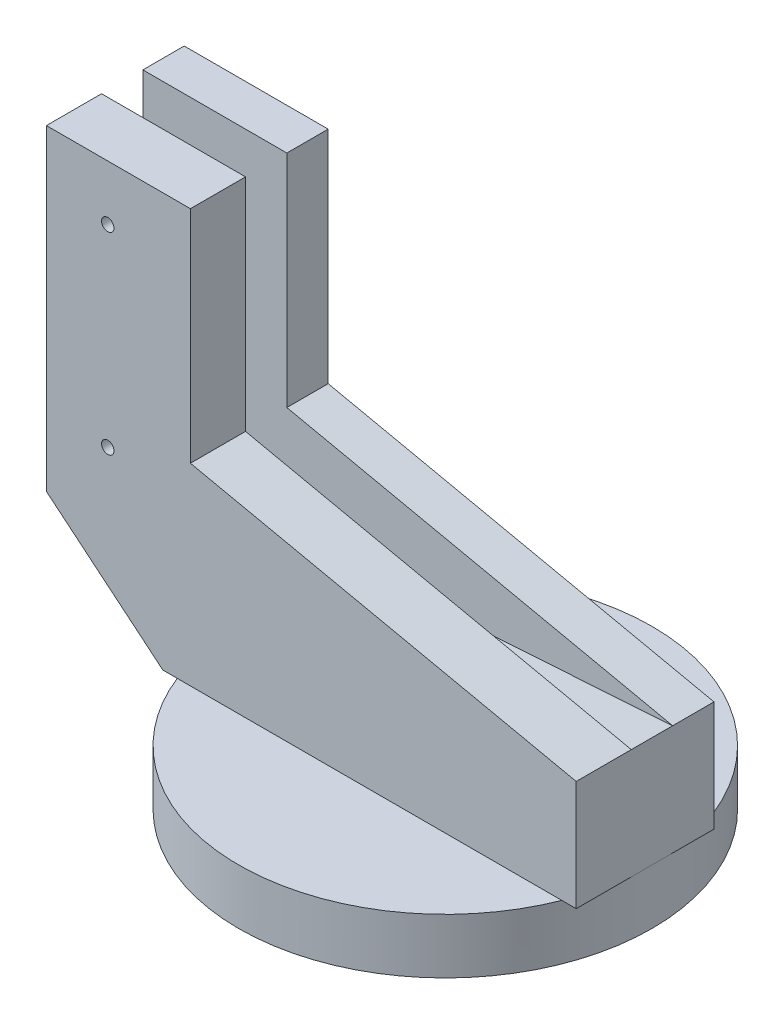
ISO-10303-21;
HEADER;
FILE_DESCRIPTION(('STEP AP214'),'2;1');
FILE_NAME('part.step','',(''),(''),'','','');
FILE_SCHEMA(('AUTOMOTIVE_DESIGN { 1 0 10303 214 1 1 1 1 }'));
ENDSEC;
DATA;
#1=APPLICATION_CONTEXT('core data for automotive mechanical design processes');
#2=APPLICATION_PROTOCOL_DEFINITION('international standard','automotive_design',2000,#1);
#3=PRODUCT_CONTEXT('',#1,'mechanical');
#4=PRODUCT('Part','Part','',(#3));
#5=PRODUCT_RELATED_PRODUCT_CATEGORY('part','',(#4));
#6=PRODUCT_DEFINITION_FORMATION('','',#4);
#7=PRODUCT_DEFINITION_CONTEXT('part definition',#1,'design');
#8=PRODUCT_DEFINITION('design','',#6,#7);
#9=PRODUCT_DEFINITION_SHAPE('','',#8);
#10=(LENGTH_UNIT() NAMED_UNIT(*) SI_UNIT(.MILLI.,.METRE.));
#11=(NAMED_UNIT(*) PLANE_ANGLE_UNIT() SI_UNIT($,.RADIAN.));
#12=(NAMED_UNIT(*) SI_UNIT($,.STERADIAN.) SOLID_ANGLE_UNIT());
#13=UNCERTAINTY_MEASURE_WITH_UNIT(LENGTH_MEASURE(1.E-05),#10,'distance_accuracy_value','');
#14=(GEOMETRIC_REPRESENTATION_CONTEXT(3) GLOBAL_UNCERTAINTY_ASSIGNED_CONTEXT((#13)) GLOBAL_UNIT_ASSIGNED_CONTEXT((#10,
#11,#12)) REPRESENTATION_CONTEXT('',''));
#15=CARTESIAN_POINT('',(0.,0.,0.));
#16=DIRECTION('',(0.,0.,1.));
#17=DIRECTION('',(1.,0.,0.));
#18=AXIS2_PLACEMENT_3D('',#15,#16,#17);
#19=CARTESIAN_POINT('',(0.,20.,0.));
#20=DIRECTION('',(0.,1.,0.));
#21=DIRECTION('',(0.,0.,1.));
#22=AXIS2_PLACEMENT_3D('',#19,#20,#21);
#23=PLANE('',#22);
#24=CARTESIAN_POINT('',(0.,20.,0.));
#25=DIRECTION('',(0.,1.,0.));
#26=DIRECTION('',(0.,0.,1.));
#27=AXIS2_PLACEMENT_3D('',#24,#25,#26);
#28=CIRCLE('',#27,75.);
#29=CARTESIAN_POINT('',(-69.7764286847643,20.,27.5));
#30=VERTEX_POINT('',#29);
#31=CARTESIAN_POINT('',(69.7764286847643,20.,27.5));
#32=VERTEX_POINT('',#31);
#33=EDGE_CURVE('E417',#30,#32,#28,.T.);
#34=ORIENTED_EDGE('',*,*,#33,.T.);
#35=DIRECTION('',(1.,0.,0.));
#36=VECTOR('',#35,1.);
#37=CARTESIAN_POINT('',(0.,20.,27.5));
#38=LINE('',#37,#36);
#39=EDGE_CURVE('E344',#30,#32,#38,.T.);
#40=ORIENTED_EDGE('',*,*,#39,.F.);
#41=EDGE_LOOP('',(#34,#40));
#42=FACE_BOUND('',#41,.T.);
#43=ADVANCED_FACE('F137',(#42),#23,.T.);
#44=CARTESIAN_POINT('',(0.,20.,0.));
#45=DIRECTION('',(0.,-1.,0.));
#46=DIRECTION('',(0.,0.,-1.));
#47=AXIS2_PLACEMENT_3D('',#44,#45,#46);
#48=CYLINDRICAL_SURFACE('',#47,75.);
#49=CARTESIAN_POINT('',(75.,20.,0.));
#50=VERTEX_POINT('',#49);
#51=EDGE_CURVE('E12',#32,#50,#28,.T.);
#52=ORIENTED_EDGE('',*,*,#51,.F.);
#53=ORIENTED_EDGE('',*,*,#33,.F.);
#54=CARTESIAN_POINT('',(-75.,20.,0.));
#55=VERTEX_POINT('',#54);
#56=EDGE_CURVE('E415',#55,#30,#28,.T.);
#57=ORIENTED_EDGE('',*,*,#56,.F.);
#58=CARTESIAN_POINT('',(-71.5454401062709,20.,-22.5));
#59=VERTEX_POINT('',#58);
#60=EDGE_CURVE('E154',#59,#55,#28,.T.);
#61=ORIENTED_EDGE('',*,*,#60,.F.);
#62=CARTESIAN_POINT('',(71.5454401062709,20.,-22.5));
#63=VERTEX_POINT('',#62);
#64=EDGE_CURVE('E147',#63,#59,#28,.T.);
#65=ORIENTED_EDGE('',*,*,#64,.F.);
#66=EDGE_CURVE('E146',#50,#63,#28,.T.);
#67=ORIENTED_EDGE('',*,*,#66,.F.);
#68=EDGE_LOOP('',(#52,#53,#57,#61,#65,#67));
#69=FACE_BOUND('',#68,.T.);
#70=CARTESIAN_POINT('',(0.,0.,0.));
#71=DIRECTION('',(0.,1.,0.));
#72=DIRECTION('',(0.,0.,1.));
#73=AXIS2_PLACEMENT_3D('',#70,#71,#72);
#74=CIRCLE('',#73,75.);
#75=CARTESIAN_POINT('',(0.,0.,75.));
#76=VERTEX_POINT('',#75);
#77=EDGE_CURVE('E141',#76,#76,#74,.T.);
#78=ORIENTED_EDGE('',*,*,#77,.T.);
#79=EDGE_LOOP('',(#78));
#80=FACE_BOUND('',#79,.T.);
#81=ADVANCED_FACE('F139',(#69,#80),#48,.T.);
#82=DIRECTION('',(-1.,0.,0.));
#83=VECTOR('',#82,1.);
#84=CARTESIAN_POINT('',(0.,20.,-22.5));
#85=LINE('',#84,#83);
#86=EDGE_CURVE('E269',#63,#59,#85,.T.);
#87=ORIENTED_EDGE('',*,*,#86,.F.);
#88=ORIENTED_EDGE('',*,*,#64,.T.);
#89=EDGE_LOOP('',(#87,#88));
#90=FACE_BOUND('',#89,.T.);
#91=ADVANCED_FACE('F422',(#90),#23,.T.);
#92=CARTESIAN_POINT('',(0.,0.,0.));
#93=DIRECTION('',(0.,1.,0.));
#94=DIRECTION('',(0.,0.,1.));
#95=AXIS2_PLACEMENT_3D('',#92,#93,#94);
#96=PLANE('',#95);
#97=ORIENTED_EDGE('',*,*,#77,.F.);
#98=EDGE_LOOP('',(#97));
#99=FACE_BOUND('',#98,.T.);
#100=ADVANCED_FACE('F442',(#99),#96,.F.);
#101=CARTESIAN_POINT('',(0.,20.,-7.5));
#102=DIRECTION('',(0.,1.,0.));
#103=DIRECTION('',(0.,0.,1.));
#104=AXIS2_PLACEMENT_3D('',#101,#102,#103);
#105=PLANE('',#104);
#106=DIRECTION('',(0.,0.,1.));
#107=VECTOR('',#106,1.);
#108=CARTESIAN_POINT('',(75.,20.,-7.5));
#109=LINE('',#108,#107);
#110=CARTESIAN_POINT('',(75.,20.,27.5));
#111=VERTEX_POINT('',#110);
#112=EDGE_CURVE('E261',#50,#111,#109,.T.);
#113=ORIENTED_EDGE('',*,*,#112,.T.);
#114=EDGE_CURVE('E339',#32,#111,#38,.T.);
#115=ORIENTED_EDGE('',*,*,#114,.F.);
#116=ORIENTED_EDGE('',*,*,#51,.T.);
#117=EDGE_LOOP('',(#113,#115,#116));
#118=FACE_BOUND('',#117,.T.);
#119=ADVANCED_FACE('F434',(#118),#105,.F.);
#120=CARTESIAN_POINT('',(75.,20.,-22.5));
#121=VERTEX_POINT('',#120);
#122=EDGE_CURVE('E384',#121,#50,#109,.T.);
#123=ORIENTED_EDGE('',*,*,#122,.T.);
#124=ORIENTED_EDGE('',*,*,#66,.T.);
#125=EDGE_CURVE('E272',#121,#63,#85,.T.);
#126=ORIENTED_EDGE('',*,*,#125,.F.);
#127=EDGE_LOOP('',(#123,#124,#126));
#128=FACE_BOUND('',#127,.T.);
#129=ADVANCED_FACE('F425',(#128),#105,.F.);
#130=DIRECTION('',(0.,0.,1.));
#131=VECTOR('',#130,1.);
#132=CARTESIAN_POINT('',(-75.,20.,-7.5));
#133=LINE('',#132,#131);
#134=CARTESIAN_POINT('',(-75.,20.,-22.5));
#135=VERTEX_POINT('',#134);
#136=EDGE_CURVE('E253',#135,#55,#133,.T.);
#137=ORIENTED_EDGE('',*,*,#136,.F.);
#138=EDGE_CURVE('E256',#59,#135,#85,.T.);
#139=ORIENTED_EDGE('',*,*,#138,.F.);
#140=ORIENTED_EDGE('',*,*,#60,.T.);
#141=EDGE_LOOP('',(#137,#139,#140));
#142=FACE_BOUND('',#141,.T.);
#143=ADVANCED_FACE('F255',(#142),#105,.F.);
#144=CARTESIAN_POINT('',(-75.,20.,27.5));
#145=VERTEX_POINT('',#144);
#146=EDGE_CURVE('E262',#55,#145,#133,.T.);
#147=ORIENTED_EDGE('',*,*,#146,.F.);
#148=ORIENTED_EDGE('',*,*,#56,.T.);
#149=EDGE_CURVE('E340',#145,#30,#38,.T.);
#150=ORIENTED_EDGE('',*,*,#149,.F.);
#151=EDGE_LOOP('',(#147,#148,#150));
#152=FACE_BOUND('',#151,.T.);
#153=ADVANCED_FACE('F414',(#152),#105,.F.);
#154=CARTESIAN_POINT('',(-3.65044247787614,54.7566371681415,-7.5));
#155=DIRECTION('',(0.0665190105237745,-0.997785157856609,0.));
#156=DIRECTION('',(0.997785157856609,0.0665190105237745,0.));
#157=AXIS2_PLACEMENT_3D('',#154,#155,#156);
#158=PLANE('',#157);
#159=DIRECTION('',(0.997785157856609,0.0665190105237745,0.));
#160=VECTOR('',#159,1.);
#161=CARTESIAN_POINT('',(-3.65044247787614,54.7566371681415,7.5));
#162=LINE('',#161,#160);
#163=CARTESIAN_POINT('',(0.,55.,7.5));
#164=VERTEX_POINT('',#163);
#165=CARTESIAN_POINT('',(75.,60.,7.5));
#166=VERTEX_POINT('',#165);
#167=EDGE_CURVE('E368',#164,#166,#162,.T.);
#168=ORIENTED_EDGE('',*,*,#167,.T.);
#169=DIRECTION('',(0.,0.,1.));
#170=VECTOR('',#169,1.);
#171=CARTESIAN_POINT('',(75.,60.,-7.5));
#172=LINE('',#171,#170);
#173=CARTESIAN_POINT('',(75.,60.,-7.5));
#174=VERTEX_POINT('',#173);
#175=EDGE_CURVE('E381',#174,#166,#172,.T.);
#176=ORIENTED_EDGE('',*,*,#175,.F.);
#177=DIRECTION('',(0.997785157856609,0.0665190105237745,0.));
#178=VECTOR('',#177,1.);
#179=CARTESIAN_POINT('',(-3.65044247787614,54.7566371681415,-7.5));
#180=LINE('',#179,#178);
#181=CARTESIAN_POINT('',(0.,55.,-7.5));
#182=VERTEX_POINT('',#181);
#183=EDGE_CURVE('E369',#182,#174,#180,.T.);
#184=ORIENTED_EDGE('',*,*,#183,.F.);
#185=DIRECTION('',(0.,0.,1.));
#186=VECTOR('',#185,1.);
#187=CARTESIAN_POINT('',(0.,55.,-7.5));
#188=LINE('',#187,#186);
#189=EDGE_CURVE('E376',#182,#164,#188,.T.);
#190=ORIENTED_EDGE('',*,*,#189,.T.);
#191=EDGE_LOOP('',(#168,#176,#184,#190));
#192=FACE_BOUND('',#191,.T.);
#193=ADVANCED_FACE('F392',(#192),#158,.F.);
#194=CARTESIAN_POINT('',(75.,0.,-7.5));
#195=DIRECTION('',(-1.,0.,0.));
#196=DIRECTION('',(0.,0.,1.));
#197=AXIS2_PLACEMENT_3D('',#194,#195,#196);
#198=PLANE('',#197);
#199=ORIENTED_EDGE('',*,*,#175,.T.);
#200=DIRECTION('',(0.,0.,-1.));
#201=VECTOR('',#200,1.);
#202=CARTESIAN_POINT('',(75.,60.,27.5));
#203=LINE('',#202,#201);
#204=CARTESIAN_POINT('',(75.,60.,27.5));
#205=VERTEX_POINT('',#204);
#206=EDGE_CURVE('E346',#205,#166,#203,.T.);
#207=ORIENTED_EDGE('',*,*,#206,.F.);
#208=DIRECTION('',(0.,1.,0.));
#209=VECTOR('',#208,1.);
#210=CARTESIAN_POINT('',(75.,0.,27.5));
#211=LINE('',#210,#209);
#212=EDGE_CURVE('E343',#111,#205,#211,.T.);
#213=ORIENTED_EDGE('',*,*,#212,.F.);
#214=ORIENTED_EDGE('',*,*,#112,.F.);
#215=ORIENTED_EDGE('',*,*,#122,.F.);
#216=DIRECTION('',(0.,-1.,0.));
#217=VECTOR('',#216,1.);
#218=CARTESIAN_POINT('',(75.,0.,-22.5));
#219=LINE('',#218,#217);
#220=CARTESIAN_POINT('',(75.,60.,-22.5));
#221=VERTEX_POINT('',#220);
#222=EDGE_CURVE('E288',#221,#121,#219,.T.);
#223=ORIENTED_EDGE('',*,*,#222,.F.);
#224=DIRECTION('',(0.,0.,1.));
#225=VECTOR('',#224,1.);
#226=CARTESIAN_POINT('',(75.,60.,-22.5));
#227=LINE('',#226,#225);
#228=EDGE_CURVE('E291',#221,#174,#227,.T.);
#229=ORIENTED_EDGE('',*,*,#228,.T.);
#230=EDGE_LOOP('',(#199,#207,#213,#214,#215,#223,#229));
#231=FACE_BOUND('',#230,.T.);
#232=ADVANCED_FACE('F428',(#231),#198,.F.);
#233=CARTESIAN_POINT('',(-20.6972446585411,-24.9845310520961,-7.5));
#234=DIRECTION('',(0.63794066640066,0.770085518726513,0.));
#235=DIRECTION('',(-0.770085518726513,0.63794066640066,0.));
#236=AXIS2_PLACEMENT_3D('',#233,#234,#235);
#237=PLANE('',#236);
#238=ORIENTED_EDGE('',*,*,#146,.T.);
#239=DIRECTION('',(0.770085518726513,-0.63794066640066,0.));
#240=VECTOR('',#239,1.);
#241=CARTESIAN_POINT('',(-20.6972446585411,-24.9845310520961,27.5));
#242=LINE('',#241,#240);
#243=CARTESIAN_POINT('',(-117.25,55.,27.5));
#244=VERTEX_POINT('',#243);
#245=EDGE_CURVE('E336',#244,#145,#242,.T.);
#246=ORIENTED_EDGE('',*,*,#245,.F.);
#247=DIRECTION('',(0.,0.,-1.));
#248=VECTOR('',#247,1.);
#249=CARTESIAN_POINT('',(-117.25,55.,27.5));
#250=LINE('',#249,#248);
#251=CARTESIAN_POINT('',(-117.25,55.,7.5));
#252=VERTEX_POINT('',#251);
#253=EDGE_CURVE('E356',#244,#252,#250,.T.);
#254=ORIENTED_EDGE('',*,*,#253,.T.);
#255=DIRECTION('',(0.,0.,1.));
#256=VECTOR('',#255,1.);
#257=CARTESIAN_POINT('',(-117.25,54.9999999999999,-7.5));
#258=LINE('',#257,#256);
#259=CARTESIAN_POINT('',(-117.25,54.9999999999999,-7.5));
#260=VERTEX_POINT('',#259);
#261=EDGE_CURVE('E386',#260,#252,#258,.T.);
#262=ORIENTED_EDGE('',*,*,#261,.F.);
#263=DIRECTION('',(0.,0.,1.));
#264=VECTOR('',#263,1.);
#265=CARTESIAN_POINT('',(-117.25,55.,-22.5));
#266=LINE('',#265,#264);
#267=CARTESIAN_POINT('',(-117.25,55.,-22.5));
#268=VERTEX_POINT('',#267);
#269=EDGE_CURVE('E275',#268,#260,#266,.T.);
#270=ORIENTED_EDGE('',*,*,#269,.F.);
#271=DIRECTION('',(-0.770085518726513,0.63794066640066,0.));
#272=VECTOR('',#271,1.);
#273=CARTESIAN_POINT('',(-20.6972446585411,-24.9845310520961,-22.5));
#274=LINE('',#273,#272);
#275=EDGE_CURVE('E267',#135,#268,#274,.T.);
#276=ORIENTED_EDGE('',*,*,#275,.F.);
#277=ORIENTED_EDGE('',*,*,#136,.T.);
#278=EDGE_LOOP('',(#238,#246,#254,#262,#270,#276,#277));
#279=FACE_BOUND('',#278,.T.);
#280=ADVANCED_FACE('F273',(#279),#237,.F.);
#281=CARTESIAN_POINT('',(0.,55.,-7.5));
#282=DIRECTION('',(0.,-1.,0.));
#283=DIRECTION('',(0.,0.,-1.));
#284=AXIS2_PLACEMENT_3D('',#281,#282,#283);
#285=PLANE('',#284);
#286=DIRECTION('',(1.,0.,0.));
#287=VECTOR('',#286,1.);
#288=CARTESIAN_POINT('',(0.,55.,7.5));
#289=LINE('',#288,#287);
#290=EDGE_CURVE('E373',#252,#164,#289,.T.);
#291=ORIENTED_EDGE('',*,*,#290,.T.);
#292=ORIENTED_EDGE('',*,*,#189,.F.);
#293=DIRECTION('',(1.,0.,0.));
#294=VECTOR('',#293,1.);
#295=CARTESIAN_POINT('',(0.,55.,-7.5));
#296=LINE('',#295,#294);
#297=EDGE_CURVE('E372',#260,#182,#296,.T.);
#298=ORIENTED_EDGE('',*,*,#297,.F.);
#299=ORIENTED_EDGE('',*,*,#261,.T.);
#300=EDGE_LOOP('',(#291,#292,#298,#299));
#301=FACE_BOUND('',#300,.T.);
#302=ADVANCED_FACE('F395',(#301),#285,.F.);
#303=CARTESIAN_POINT('',(0.,0.,7.5));
#304=DIRECTION('',(0.,0.,-1.));
#305=DIRECTION('',(-1.,0.,0.));
#306=AXIS2_PLACEMENT_3D('',#303,#304,#305);
#307=PLANE('',#306);
#308=CARTESIAN_POINT('',(-95.,80.,7.5));
#309=DIRECTION('',(0.,0.,1.));
#310=DIRECTION('',(1.,0.,0.));
#311=AXIS2_PLACEMENT_3D('',#308,#309,#310);
#312=CIRCLE('',#311,2.25);
#313=CARTESIAN_POINT('',(-92.75,80.,7.5));
#314=VERTEX_POINT('',#313);
#315=EDGE_CURVE('E313',#314,#314,#312,.T.);
#316=ORIENTED_EDGE('',*,*,#315,.T.);
#317=EDGE_LOOP('',(#316));
#318=FACE_BOUND('',#317,.T.);
#319=CARTESIAN_POINT('',(-95.,150.,7.5));
#320=DIRECTION('',(0.,0.,1.));
#321=DIRECTION('',(1.,0.,0.));
#322=AXIS2_PLACEMENT_3D('',#319,#320,#321);
#323=CIRCLE('',#322,2.25);
#324=CARTESIAN_POINT('',(-92.75,150.,7.5));
#325=VERTEX_POINT('',#324);
#326=EDGE_CURVE('E317',#325,#325,#323,.T.);
#327=ORIENTED_EDGE('',*,*,#326,.T.);
#328=EDGE_LOOP('',(#327));
#329=FACE_BOUND('',#328,.T.);
#330=ORIENTED_EDGE('',*,*,#167,.F.);
#331=ORIENTED_EDGE('',*,*,#290,.F.);
#332=DIRECTION('',(0.,-1.,0.));
#333=VECTOR('',#332,1.);
#334=CARTESIAN_POINT('',(-117.25,0.,7.5));
#335=LINE('',#334,#333);
#336=CARTESIAN_POINT('',(-117.25,170.,7.5));
#337=VERTEX_POINT('',#336);
#338=EDGE_CURVE('E330',#337,#252,#335,.T.);
#339=ORIENTED_EDGE('',*,*,#338,.F.);
#340=DIRECTION('',(-1.,0.,0.));
#341=VECTOR('',#340,1.);
#342=CARTESIAN_POINT('',(0.,170.,7.5));
#343=LINE('',#342,#341);
#344=CARTESIAN_POINT('',(-65.,170.,7.5));
#345=VERTEX_POINT('',#344);
#346=EDGE_CURVE('E351',#345,#337,#343,.T.);
#347=ORIENTED_EDGE('',*,*,#346,.F.);
#348=DIRECTION('',(0.,1.,0.));
#349=VECTOR('',#348,1.);
#350=CARTESIAN_POINT('',(-65.,0.,7.5));
#351=LINE('',#350,#349);
#352=CARTESIAN_POINT('',(-65.,90.,7.5));
#353=VERTEX_POINT('',#352);
#354=EDGE_CURVE('E349',#353,#345,#351,.T.);
#355=ORIENTED_EDGE('',*,*,#354,.F.);
#356=DIRECTION('',(-0.97780241407741,0.209529088730873,0.));
#357=VECTOR('',#356,1.);
#358=CARTESIAN_POINT('',(15.5853658536585,72.7317073170732,7.5));
#359=LINE('',#358,#357);
#360=EDGE_CURVE('E323',#166,#353,#359,.T.);
#361=ORIENTED_EDGE('',*,*,#360,.F.);
#362=EDGE_LOOP('',(#330,#331,#339,#347,#355,#361));
#363=FACE_BOUND('',#362,.T.);
#364=ADVANCED_FACE('F398',(#318,#329,#363),#307,.T.);
#365=CARTESIAN_POINT('',(0.,0.,27.5));
#366=DIRECTION('',(0.,0.,-1.));
#367=DIRECTION('',(-1.,0.,0.));
#368=AXIS2_PLACEMENT_3D('',#365,#366,#367);
#369=PLANE('',#368);
#370=DIRECTION('',(-0.97780241407741,0.209529088730873,0.));
#371=VECTOR('',#370,1.);
#372=CARTESIAN_POINT('',(15.5853658536585,72.7317073170732,27.5));
#373=LINE('',#372,#371);
#374=CARTESIAN_POINT('',(-65.,90.,27.5));
#375=VERTEX_POINT('',#374);
#376=EDGE_CURVE('E326',#205,#375,#373,.T.);
#377=ORIENTED_EDGE('',*,*,#376,.T.);
#378=DIRECTION('',(0.,1.,0.));
#379=VECTOR('',#378,1.);
#380=CARTESIAN_POINT('',(-65.,0.,27.5));
#381=LINE('',#380,#379);
#382=CARTESIAN_POINT('',(-65.,170.,27.5));
#383=VERTEX_POINT('',#382);
#384=EDGE_CURVE('E329',#375,#383,#381,.T.);
#385=ORIENTED_EDGE('',*,*,#384,.T.);
#386=DIRECTION('',(-1.,0.,0.));
#387=VECTOR('',#386,1.);
#388=CARTESIAN_POINT('',(0.,170.,27.5));
#389=LINE('',#388,#387);
#390=CARTESIAN_POINT('',(-117.25,170.,27.5));
#391=VERTEX_POINT('',#390);
#392=EDGE_CURVE('E332',#383,#391,#389,.T.);
#393=ORIENTED_EDGE('',*,*,#392,.T.);
#394=DIRECTION('',(0.,-1.,0.));
#395=VECTOR('',#394,1.);
#396=CARTESIAN_POINT('',(-117.25,0.,27.5));
#397=LINE('',#396,#395);
#398=EDGE_CURVE('E334',#391,#244,#397,.T.);
#399=ORIENTED_EDGE('',*,*,#398,.T.);
#400=ORIENTED_EDGE('',*,*,#245,.T.);
#401=ORIENTED_EDGE('',*,*,#149,.T.);
#402=ORIENTED_EDGE('',*,*,#39,.T.);
#403=ORIENTED_EDGE('',*,*,#114,.T.);
#404=ORIENTED_EDGE('',*,*,#212,.T.);
#405=EDGE_LOOP('',(#377,#385,#393,#399,#400,#401,#402,#403,#404));
#406=FACE_BOUND('',#405,.T.);
#407=CARTESIAN_POINT('',(-95.,150.,27.5));
#408=DIRECTION('',(0.,0.,1.));
#409=DIRECTION('',(1.,0.,0.));
#410=AXIS2_PLACEMENT_3D('',#407,#408,#409);
#411=CIRCLE('',#410,2.25);
#412=CARTESIAN_POINT('',(-92.75,150.,27.5));
#413=VERTEX_POINT('',#412);
#414=EDGE_CURVE('E320',#413,#413,#411,.T.);
#415=ORIENTED_EDGE('',*,*,#414,.F.);
#416=EDGE_LOOP('',(#415));
#417=FACE_BOUND('',#416,.T.);
#418=CARTESIAN_POINT('',(-95.,80.,27.5));
#419=DIRECTION('',(0.,0.,1.));
#420=DIRECTION('',(1.,0.,0.));
#421=AXIS2_PLACEMENT_3D('',#418,#419,#420);
#422=CIRCLE('',#421,2.25);
#423=CARTESIAN_POINT('',(-92.75,80.,27.5));
#424=VERTEX_POINT('',#423);
#425=EDGE_CURVE('E314',#424,#424,#422,.T.);
#426=ORIENTED_EDGE('',*,*,#425,.F.);
#427=EDGE_LOOP('',(#426));
#428=FACE_BOUND('',#427,.T.);
#429=ADVANCED_FACE('F409',(#406,#417,#428),#369,.F.);
#430=CARTESIAN_POINT('',(15.5853658536585,72.7317073170732,27.5));
#431=DIRECTION('',(-0.209529088730873,-0.97780241407741,0.));
#432=DIRECTION('',(0.97780241407741,-0.209529088730873,0.));
#433=AXIS2_PLACEMENT_3D('',#430,#431,#432);
#434=PLANE('',#433);
#435=ORIENTED_EDGE('',*,*,#360,.T.);
#436=DIRECTION('',(0.,0.,-1.));
#437=VECTOR('',#436,1.);
#438=CARTESIAN_POINT('',(-65.,90.,27.5));
#439=LINE('',#438,#437);
#440=EDGE_CURVE('E365',#375,#353,#439,.T.);
#441=ORIENTED_EDGE('',*,*,#440,.F.);
#442=ORIENTED_EDGE('',*,*,#376,.F.);
#443=ORIENTED_EDGE('',*,*,#206,.T.);
#444=EDGE_LOOP('',(#435,#441,#442,#443));
#445=FACE_BOUND('',#444,.T.);
#446=ADVANCED_FACE('F531',(#445),#434,.F.);
#447=CARTESIAN_POINT('',(-65.,0.,27.5));
#448=DIRECTION('',(-1.,0.,0.));
#449=DIRECTION('',(0.,-1.,0.));
#450=AXIS2_PLACEMENT_3D('',#447,#448,#449);
#451=PLANE('',#450);
#452=ORIENTED_EDGE('',*,*,#354,.T.);
#453=DIRECTION('',(0.,0.,-1.));
#454=VECTOR('',#453,1.);
#455=CARTESIAN_POINT('',(-65.,170.,27.5));
#456=LINE('',#455,#454);
#457=EDGE_CURVE('E362',#383,#345,#456,.T.);
#458=ORIENTED_EDGE('',*,*,#457,.F.);
#459=ORIENTED_EDGE('',*,*,#384,.F.);
#460=ORIENTED_EDGE('',*,*,#440,.T.);
#461=EDGE_LOOP('',(#452,#458,#459,#460));
#462=FACE_BOUND('',#461,.T.);
#463=ADVANCED_FACE('F521',(#462),#451,.F.);
#464=CARTESIAN_POINT('',(0.,170.,27.5));
#465=DIRECTION('',(0.,-1.,0.));
#466=DIRECTION('',(0.,0.,-1.));
#467=AXIS2_PLACEMENT_3D('',#464,#465,#466);
#468=PLANE('',#467);
#469=ORIENTED_EDGE('',*,*,#346,.T.);
#470=DIRECTION('',(0.,0.,-1.));
#471=VECTOR('',#470,1.);
#472=CARTESIAN_POINT('',(-117.25,170.,27.5));
#473=LINE('',#472,#471);
#474=EDGE_CURVE('E359',#391,#337,#473,.T.);
#475=ORIENTED_EDGE('',*,*,#474,.F.);
#476=ORIENTED_EDGE('',*,*,#392,.F.);
#477=ORIENTED_EDGE('',*,*,#457,.T.);
#478=EDGE_LOOP('',(#469,#475,#476,#477));
#479=FACE_BOUND('',#478,.T.);
#480=ADVANCED_FACE('F512',(#479),#468,.F.);
#481=CARTESIAN_POINT('',(-117.25,0.,27.5));
#482=DIRECTION('',(1.,0.,0.));
#483=DIRECTION('',(0.,0.,-1.));
#484=AXIS2_PLACEMENT_3D('',#481,#482,#483);
#485=PLANE('',#484);
#486=ORIENTED_EDGE('',*,*,#338,.T.);
#487=ORIENTED_EDGE('',*,*,#253,.F.);
#488=ORIENTED_EDGE('',*,*,#398,.F.);
#489=ORIENTED_EDGE('',*,*,#474,.T.);
#490=EDGE_LOOP('',(#486,#487,#488,#489));
#491=FACE_BOUND('',#490,.T.);
#492=ADVANCED_FACE('F403',(#491),#485,.F.);
#493=CARTESIAN_POINT('',(-95.,150.,27.5));
#494=DIRECTION('',(0.,0.,-1.));
#495=DIRECTION('',(-1.,0.,0.));
#496=AXIS2_PLACEMENT_3D('',#493,#494,#495);
#497=CYLINDRICAL_SURFACE('',#496,2.25);
#498=ORIENTED_EDGE('',*,*,#414,.T.);
#499=EDGE_LOOP('',(#498));
#500=FACE_BOUND('',#499,.T.);
#501=ORIENTED_EDGE('',*,*,#326,.F.);
#502=EDGE_LOOP('',(#501));
#503=FACE_BOUND('',#502,.T.);
#504=ADVANCED_FACE('F492',(#500,#503),#497,.F.);
#505=CARTESIAN_POINT('',(-95.,80.,27.5));
#506=DIRECTION('',(0.,0.,-1.));
#507=DIRECTION('',(-1.,0.,0.));
#508=AXIS2_PLACEMENT_3D('',#505,#506,#507);
#509=CYLINDRICAL_SURFACE('',#508,2.25);
#510=ORIENTED_EDGE('',*,*,#425,.T.);
#511=EDGE_LOOP('',(#510));
#512=FACE_BOUND('',#511,.T.);
#513=ORIENTED_EDGE('',*,*,#315,.F.);
#514=EDGE_LOOP('',(#513));
#515=FACE_BOUND('',#514,.T.);
#516=ADVANCED_FACE('F487',(#512,#515),#509,.F.);
#517=CARTESIAN_POINT('',(0.,0.,-7.5));
#518=DIRECTION('',(0.,0.,-1.));
#519=DIRECTION('',(-1.,0.,0.));
#520=AXIS2_PLACEMENT_3D('',#517,#518,#519);
#521=PLANE('',#520);
#522=CARTESIAN_POINT('',(-95.,80.,-7.5));
#523=DIRECTION('',(0.,0.,1.));
#524=DIRECTION('',(1.,0.,0.));
#525=AXIS2_PLACEMENT_3D('',#522,#523,#524);
#526=CIRCLE('',#525,2.25);
#527=CARTESIAN_POINT('',(-92.75,80.,-7.5));
#528=VERTEX_POINT('',#527);
#529=EDGE_CURVE('E708',#528,#528,#526,.T.);
#530=ORIENTED_EDGE('',*,*,#529,.F.);
#531=EDGE_LOOP('',(#530));
#532=FACE_BOUND('',#531,.T.);
#533=CARTESIAN_POINT('',(-95.,150.,-7.5));
#534=DIRECTION('',(0.,0.,1.));
#535=DIRECTION('',(1.,0.,0.));
#536=AXIS2_PLACEMENT_3D('',#533,#534,#535);
#537=CIRCLE('',#536,2.25);
#538=CARTESIAN_POINT('',(-92.75,150.,-7.5));
#539=VERTEX_POINT('',#538);
#540=EDGE_CURVE('E710',#539,#539,#537,.T.);
#541=ORIENTED_EDGE('',*,*,#540,.F.);
#542=EDGE_LOOP('',(#541));
#543=FACE_BOUND('',#542,.T.);
#544=ORIENTED_EDGE('',*,*,#297,.T.);
#545=ORIENTED_EDGE('',*,*,#183,.T.);
#546=DIRECTION('',(0.97780241407741,-0.209529088730873,0.));
#547=VECTOR('',#546,1.);
#548=CARTESIAN_POINT('',(15.5853658536585,72.7317073170732,-7.5));
#549=LINE('',#548,#547);
#550=CARTESIAN_POINT('',(-65.0000000000001,90.,-7.5));
#551=VERTEX_POINT('',#550);
#552=EDGE_CURVE('E270',#551,#174,#549,.T.);
#553=ORIENTED_EDGE('',*,*,#552,.F.);
#554=DIRECTION('',(0.,-1.,0.));
#555=VECTOR('',#554,1.);
#556=CARTESIAN_POINT('',(-65.,0.,-7.5));
#557=LINE('',#556,#555);
#558=CARTESIAN_POINT('',(-65.,170.,-7.5));
#559=VERTEX_POINT('',#558);
#560=EDGE_CURVE('E297',#559,#551,#557,.T.);
#561=ORIENTED_EDGE('',*,*,#560,.F.);
#562=DIRECTION('',(1.,0.,0.));
#563=VECTOR('',#562,1.);
#564=CARTESIAN_POINT('',(0.,170.,-7.5));
#565=LINE('',#564,#563);
#566=CARTESIAN_POINT('',(-117.25,170.,-7.5));
#567=VERTEX_POINT('',#566);
#568=EDGE_CURVE('E294',#567,#559,#565,.T.);
#569=ORIENTED_EDGE('',*,*,#568,.F.);
#570=DIRECTION('',(0.,1.,0.));
#571=VECTOR('',#570,1.);
#572=CARTESIAN_POINT('',(-117.25,0.,-7.5));
#573=LINE('',#572,#571);
#574=EDGE_CURVE('E292',#260,#567,#573,.T.);
#575=ORIENTED_EDGE('',*,*,#574,.F.);
#576=EDGE_LOOP('',(#544,#545,#553,#561,#569,#575));
#577=FACE_BOUND('',#576,.T.);
#578=ADVANCED_FACE('F491',(#532,#543,#577),#521,.F.);
#579=CARTESIAN_POINT('',(-117.25,0.,-22.5));
#580=DIRECTION('',(1.,0.,0.));
#581=DIRECTION('',(0.,0.,-1.));
#582=AXIS2_PLACEMENT_3D('',#579,#580,#581);
#583=PLANE('',#582);
#584=ORIENTED_EDGE('',*,*,#574,.T.);
#585=DIRECTION('',(0.,0.,1.));
#586=VECTOR('',#585,1.);
#587=CARTESIAN_POINT('',(-117.25,170.,-22.5));
#588=LINE('',#587,#586);
#589=CARTESIAN_POINT('',(-117.25,170.,-22.5));
#590=VERTEX_POINT('',#589);
#591=EDGE_CURVE('E309',#590,#567,#588,.T.);
#592=ORIENTED_EDGE('',*,*,#591,.F.);
#593=DIRECTION('',(0.,1.,0.));
#594=VECTOR('',#593,1.);
#595=CARTESIAN_POINT('',(-117.25,0.,-22.5));
#596=LINE('',#595,#594);
#597=EDGE_CURVE('E277',#268,#590,#596,.T.);
#598=ORIENTED_EDGE('',*,*,#597,.F.);
#599=ORIENTED_EDGE('',*,*,#269,.T.);
#600=EDGE_LOOP('',(#584,#592,#598,#599));
#601=FACE_BOUND('',#600,.T.);
#602=ADVANCED_FACE('F627',(#601),#583,.F.);
#603=CARTESIAN_POINT('',(0.,170.,-22.5));
#604=DIRECTION('',(0.,-1.,0.));
#605=DIRECTION('',(0.,0.,-1.));
#606=AXIS2_PLACEMENT_3D('',#603,#604,#605);
#607=PLANE('',#606);
#608=ORIENTED_EDGE('',*,*,#568,.T.);
#609=DIRECTION('',(0.,0.,1.));
#610=VECTOR('',#609,1.);
#611=CARTESIAN_POINT('',(-65.,170.,-22.5));
#612=LINE('',#611,#610);
#613=CARTESIAN_POINT('',(-65.,170.,-22.5));
#614=VERTEX_POINT('',#613);
#615=EDGE_CURVE('E306',#614,#559,#612,.T.);
#616=ORIENTED_EDGE('',*,*,#615,.F.);
#617=DIRECTION('',(1.,0.,0.));
#618=VECTOR('',#617,1.);
#619=CARTESIAN_POINT('',(0.,170.,-22.5));
#620=LINE('',#619,#618);
#621=EDGE_CURVE('E279',#590,#614,#620,.T.);
#622=ORIENTED_EDGE('',*,*,#621,.F.);
#623=ORIENTED_EDGE('',*,*,#591,.T.);
#624=EDGE_LOOP('',(#608,#616,#622,#623));
#625=FACE_BOUND('',#624,.T.);
#626=ADVANCED_FACE('F638',(#625),#607,.F.);
#627=CARTESIAN_POINT('',(-65.,0.,-22.5));
#628=DIRECTION('',(-1.,0.,0.));
#629=DIRECTION('',(0.,-1.,0.));
#630=AXIS2_PLACEMENT_3D('',#627,#628,#629);
#631=PLANE('',#630);
#632=ORIENTED_EDGE('',*,*,#560,.T.);
#633=DIRECTION('',(0.,0.,1.));
#634=VECTOR('',#633,1.);
#635=CARTESIAN_POINT('',(-65.0000000000001,90.,-22.5));
#636=LINE('',#635,#634);
#637=CARTESIAN_POINT('',(-65.0000000000001,90.,-22.5));
#638=VERTEX_POINT('',#637);
#639=EDGE_CURVE('E303',#638,#551,#636,.T.);
#640=ORIENTED_EDGE('',*,*,#639,.F.);
#641=DIRECTION('',(0.,-1.,0.));
#642=VECTOR('',#641,1.);
#643=CARTESIAN_POINT('',(-65.,0.,-22.5));
#644=LINE('',#643,#642);
#645=EDGE_CURVE('E284',#614,#638,#644,.T.);
#646=ORIENTED_EDGE('',*,*,#645,.F.);
#647=ORIENTED_EDGE('',*,*,#615,.T.);
#648=EDGE_LOOP('',(#632,#640,#646,#647));
#649=FACE_BOUND('',#648,.T.);
#650=ADVANCED_FACE('F648',(#649),#631,.F.);
#651=CARTESIAN_POINT('',(15.5853658536585,72.7317073170732,-22.5));
#652=DIRECTION('',(-0.209529088730873,-0.97780241407741,0.));
#653=DIRECTION('',(0.97780241407741,-0.209529088730873,0.));
#654=AXIS2_PLACEMENT_3D('',#651,#652,#653);
#655=PLANE('',#654);
#656=ORIENTED_EDGE('',*,*,#552,.T.);
#657=ORIENTED_EDGE('',*,*,#228,.F.);
#658=DIRECTION('',(0.97780241407741,-0.209529088730873,0.));
#659=VECTOR('',#658,1.);
#660=CARTESIAN_POINT('',(15.5853658536585,72.7317073170732,-22.5));
#661=LINE('',#660,#659);
#662=EDGE_CURVE('E286',#638,#221,#661,.T.);
#663=ORIENTED_EDGE('',*,*,#662,.F.);
#664=ORIENTED_EDGE('',*,*,#639,.T.);
#665=EDGE_LOOP('',(#656,#657,#663,#664));
#666=FACE_BOUND('',#665,.T.);
#667=ADVANCED_FACE('F658',(#666),#655,.F.);
#668=CARTESIAN_POINT('',(0.,0.,-22.5));
#669=DIRECTION('',(0.,0.,-1.));
#670=DIRECTION('',(-1.,0.,0.));
#671=AXIS2_PLACEMENT_3D('',#668,#669,#670);
#672=PLANE('',#671);
#673=CARTESIAN_POINT('',(-95.,80.,-22.5));
#674=DIRECTION('',(0.,0.,1.));
#675=DIRECTION('',(1.,0.,0.));
#676=AXIS2_PLACEMENT_3D('',#673,#674,#675);
#677=CIRCLE('',#676,2.25);
#678=CARTESIAN_POINT('',(-92.75,80.,-22.5));
#679=VERTEX_POINT('',#678);
#680=EDGE_CURVE('E705',#679,#679,#677,.T.);
#681=ORIENTED_EDGE('',*,*,#680,.T.);
#682=EDGE_LOOP('',(#681));
#683=FACE_BOUND('',#682,.T.);
#684=CARTESIAN_POINT('',(-95.,150.,-22.5));
#685=DIRECTION('',(0.,0.,1.));
#686=DIRECTION('',(1.,0.,0.));
#687=AXIS2_PLACEMENT_3D('',#684,#685,#686);
#688=CIRCLE('',#687,2.25);
#689=CARTESIAN_POINT('',(-92.75,150.,-22.5));
#690=VERTEX_POINT('',#689);
#691=EDGE_CURVE('E295',#690,#690,#688,.T.);
#692=ORIENTED_EDGE('',*,*,#691,.T.);
#693=EDGE_LOOP('',(#692));
#694=FACE_BOUND('',#693,.T.);
#695=ORIENTED_EDGE('',*,*,#125,.T.);
#696=ORIENTED_EDGE('',*,*,#86,.T.);
#697=ORIENTED_EDGE('',*,*,#138,.T.);
#698=ORIENTED_EDGE('',*,*,#275,.T.);
#699=ORIENTED_EDGE('',*,*,#597,.T.);
#700=ORIENTED_EDGE('',*,*,#621,.T.);
#701=ORIENTED_EDGE('',*,*,#645,.T.);
#702=ORIENTED_EDGE('',*,*,#662,.T.);
#703=ORIENTED_EDGE('',*,*,#222,.T.);
#704=EDGE_LOOP('',(#695,#696,#697,#698,#699,#700,#701,#702,#703));
#705=FACE_BOUND('',#704,.T.);
#706=ADVANCED_FACE('F266',(#683,#694,#705),#672,.T.);
#707=CARTESIAN_POINT('',(-95.,150.,-22.5));
#708=DIRECTION('',(0.,0.,1.));
#709=DIRECTION('',(1.,0.,0.));
#710=AXIS2_PLACEMENT_3D('',#707,#708,#709);
#711=CYLINDRICAL_SURFACE('',#710,2.25);
#712=ORIENTED_EDGE('',*,*,#691,.F.);
#713=EDGE_LOOP('',(#712));
#714=FACE_BOUND('',#713,.T.);
#715=ORIENTED_EDGE('',*,*,#540,.T.);
#716=EDGE_LOOP('',(#715));
#717=FACE_BOUND('',#716,.T.);
#718=ADVANCED_FACE('F678',(#714,#717),#711,.F.);
#719=CARTESIAN_POINT('',(-95.,80.,-22.5));
#720=DIRECTION('',(0.,0.,1.));
#721=DIRECTION('',(1.,0.,0.));
#722=AXIS2_PLACEMENT_3D('',#719,#720,#721);
#723=CYLINDRICAL_SURFACE('',#722,2.25);
#724=ORIENTED_EDGE('',*,*,#680,.F.);
#725=EDGE_LOOP('',(#724));
#726=FACE_BOUND('',#725,.T.);
#727=ORIENTED_EDGE('',*,*,#529,.T.);
#728=EDGE_LOOP('',(#727));
#729=FACE_BOUND('',#728,.T.);
#730=ADVANCED_FACE('F688',(#726,#729),#723,.F.);
#731=CLOSED_SHELL('',(#43,#81,#91,#100,#119,#129,#143,#153,#193,#232,#280,#302,#364,#429,#446,
#463,#480,#492,#504,#516,#578,#602,#626,#650,#667,#706,#718,#730));
#732=MANIFOLD_SOLID_BREP('B2',#731);
#733=ADVANCED_BREP_SHAPE_REPRESENTATION('',(#18,#732),#14);
#734=SHAPE_DEFINITION_REPRESENTATION(#9,#733);
ENDSEC;
END-ISO-10303-21;
